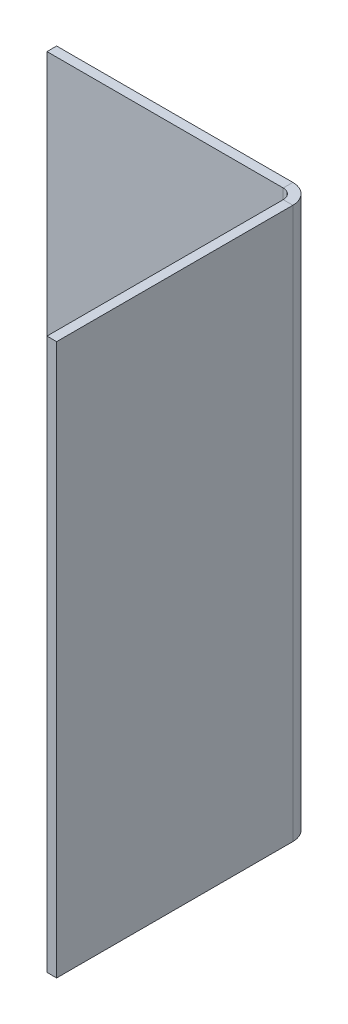
ISO-10303-21;
HEADER;
FILE_DESCRIPTION(('STEP AP214'),'2;1');
FILE_NAME('part.step','',(''),(''),'','','');
FILE_SCHEMA(('AUTOMOTIVE_DESIGN { 1 0 10303 214 1 1 1 1 }'));
ENDSEC;
DATA;
#1=APPLICATION_CONTEXT('core data for automotive mechanical design processes');
#2=APPLICATION_PROTOCOL_DEFINITION('international standard','automotive_design',2000,#1);
#3=PRODUCT_CONTEXT('',#1,'mechanical');
#4=PRODUCT('Part','Part','',(#3));
#5=PRODUCT_RELATED_PRODUCT_CATEGORY('part','',(#4));
#6=PRODUCT_DEFINITION_FORMATION('','',#4);
#7=PRODUCT_DEFINITION_CONTEXT('part definition',#1,'design');
#8=PRODUCT_DEFINITION('design','',#6,#7);
#9=PRODUCT_DEFINITION_SHAPE('','',#8);
#10=(LENGTH_UNIT() NAMED_UNIT(*) SI_UNIT(.MILLI.,.METRE.));
#11=(NAMED_UNIT(*) PLANE_ANGLE_UNIT() SI_UNIT($,.RADIAN.));
#12=(NAMED_UNIT(*) SI_UNIT($,.STERADIAN.) SOLID_ANGLE_UNIT());
#13=UNCERTAINTY_MEASURE_WITH_UNIT(LENGTH_MEASURE(1.E-05),#10,'distance_accuracy_value','');
#14=(GEOMETRIC_REPRESENTATION_CONTEXT(3) GLOBAL_UNCERTAINTY_ASSIGNED_CONTEXT((#13)) GLOBAL_UNIT_ASSIGNED_CONTEXT((#10,
#11,#12)) REPRESENTATION_CONTEXT('',''));
#15=CARTESIAN_POINT('',(0.,0.,0.));
#16=DIRECTION('',(0.,0.,1.));
#17=DIRECTION('',(1.,0.,0.));
#18=AXIS2_PLACEMENT_3D('',#15,#16,#17);
#19=CARTESIAN_POINT('',(17.8831863556524,0.,-18.1168136443477));
#20=DIRECTION('',(1.,0.,0.));
#21=DIRECTION('',(0.,0.,-1.));
#22=AXIS2_PLACEMENT_3D('',#19,#20,#21);
#23=PLANE('',#22);
#24=DIRECTION('',(0.,0.,-1.));
#25=VECTOR('',#24,1.);
#26=CARTESIAN_POINT('',(17.8831863556524,40.,-18.1168136443477));
#27=LINE('',#26,#25);
#28=CARTESIAN_POINT('',(17.8831863556523,40.,17.8831863556523));
#29=VERTEX_POINT('',#28);
#30=CARTESIAN_POINT('',(17.8831863556523,40.,0.736600000000004));
#31=VERTEX_POINT('',#30);
#32=EDGE_CURVE('E60',#29,#31,#27,.T.);
#33=ORIENTED_EDGE('',*,*,#32,.T.);
#34=DIRECTION('',(0.,-1.,0.));
#35=VECTOR('',#34,1.);
#36=CARTESIAN_POINT('',(17.8831863556523,0.,0.7366));
#37=LINE('',#36,#35);
#38=CARTESIAN_POINT('',(17.8831863556523,0.,0.7366));
#39=VERTEX_POINT('',#38);
#40=EDGE_CURVE('E52',#31,#39,#37,.T.);
#41=ORIENTED_EDGE('',*,*,#40,.T.);
#42=DIRECTION('',(0.,0.,1.));
#43=VECTOR('',#42,1.);
#44=CARTESIAN_POINT('',(17.8831863556524,0.,-18.1168136443477));
#45=LINE('',#44,#43);
#46=CARTESIAN_POINT('',(17.8831863556523,0.,17.8831863556523));
#47=VERTEX_POINT('',#46);
#48=EDGE_CURVE('E68',#39,#47,#45,.T.);
#49=ORIENTED_EDGE('',*,*,#48,.T.);
#50=DIRECTION('',(0.,1.,0.));
#51=VECTOR('',#50,1.);
#52=CARTESIAN_POINT('',(17.8831863556523,0.,17.8831863556523));
#53=LINE('',#52,#51);
#54=EDGE_CURVE('E158',#47,#29,#53,.T.);
#55=ORIENTED_EDGE('',*,*,#54,.T.);
#56=EDGE_LOOP('',(#33,#41,#49,#55));
#57=FACE_BOUND('',#56,.T.);
#58=ADVANCED_FACE('F43',(#57),#23,.F.);
#59=CARTESIAN_POINT('',(18.5831863556524,40.,-18.1168136443477));
#60=DIRECTION('',(0.,1.,0.));
#61=DIRECTION('',(-1.,0.,0.));
#62=AXIS2_PLACEMENT_3D('',#59,#60,#61);
#63=PLANE('',#62);
#64=DIRECTION('',(1.,0.,0.));
#65=VECTOR('',#64,1.);
#66=CARTESIAN_POINT('',(18.5831863556523,40.,0.736600000000004));
#67=LINE('',#66,#65);
#68=CARTESIAN_POINT('',(18.5831863556523,40.,0.736600000000007));
#69=VERTEX_POINT('',#68);
#70=EDGE_CURVE('E12',#31,#69,#67,.T.);
#71=ORIENTED_EDGE('',*,*,#70,.F.);
#72=ORIENTED_EDGE('',*,*,#32,.F.);
#73=DIRECTION('',(-1.,0.,0.));
#74=VECTOR('',#73,1.);
#75=CARTESIAN_POINT('',(18.5831863556523,40.,17.8831863556523));
#76=LINE('',#75,#74);
#77=CARTESIAN_POINT('',(18.5831863556523,40.,17.8831863556523));
#78=VERTEX_POINT('',#77);
#79=EDGE_CURVE('E160',#78,#29,#76,.T.);
#80=ORIENTED_EDGE('',*,*,#79,.F.);
#81=DIRECTION('',(0.,0.,-1.));
#82=VECTOR('',#81,1.);
#83=CARTESIAN_POINT('',(18.5831863556524,40.,-18.1168136443477));
#84=LINE('',#83,#82);
#85=EDGE_CURVE('E157',#78,#69,#84,.T.);
#86=ORIENTED_EDGE('',*,*,#85,.T.);
#87=EDGE_LOOP('',(#71,#72,#80,#86));
#88=FACE_BOUND('',#87,.T.);
#89=ADVANCED_FACE('F45',(#88),#63,.T.);
#90=CARTESIAN_POINT('',(18.5831863556523,0.,17.8831863556523));
#91=DIRECTION('',(0.,0.,1.));
#92=DIRECTION('',(1.,0.,0.));
#93=AXIS2_PLACEMENT_3D('',#90,#91,#92);
#94=PLANE('',#93);
#95=ORIENTED_EDGE('',*,*,#54,.F.);
#96=DIRECTION('',(-1.,0.,0.));
#97=VECTOR('',#96,1.);
#98=CARTESIAN_POINT('',(18.5831863556523,0.,17.8831863556523));
#99=LINE('',#98,#97);
#100=CARTESIAN_POINT('',(18.5831863556523,0.,17.8831863556523));
#101=VERTEX_POINT('',#100);
#102=EDGE_CURVE('E162',#101,#47,#99,.T.);
#103=ORIENTED_EDGE('',*,*,#102,.F.);
#104=DIRECTION('',(0.,1.,0.));
#105=VECTOR('',#104,1.);
#106=CARTESIAN_POINT('',(18.5831863556523,0.,17.8831863556523));
#107=LINE('',#106,#105);
#108=EDGE_CURVE('E154',#101,#78,#107,.T.);
#109=ORIENTED_EDGE('',*,*,#108,.T.);
#110=ORIENTED_EDGE('',*,*,#79,.T.);
#111=EDGE_LOOP('',(#95,#103,#109,#110));
#112=FACE_BOUND('',#111,.T.);
#113=ADVANCED_FACE('F178',(#112),#94,.T.);
#114=CARTESIAN_POINT('',(18.5831863556524,0.,-18.1168136443477));
#115=DIRECTION('',(0.,-1.,0.));
#116=DIRECTION('',(1.,0.,0.));
#117=AXIS2_PLACEMENT_3D('',#114,#115,#116);
#118=PLANE('',#117);
#119=DIRECTION('',(-1.,0.,0.));
#120=VECTOR('',#119,1.);
#121=CARTESIAN_POINT('',(18.5831863556523,0.,0.736600000000004));
#122=LINE('',#121,#120);
#123=CARTESIAN_POINT('',(18.5831863556523,0.,0.736600000000006));
#124=VERTEX_POINT('',#123);
#125=EDGE_CURVE('E165',#124,#39,#122,.T.);
#126=ORIENTED_EDGE('',*,*,#125,.F.);
#127=DIRECTION('',(0.,0.,1.));
#128=VECTOR('',#127,1.);
#129=CARTESIAN_POINT('',(18.5831863556524,0.,-18.1168136443477));
#130=LINE('',#129,#128);
#131=EDGE_CURVE('E47',#124,#101,#130,.T.);
#132=ORIENTED_EDGE('',*,*,#131,.T.);
#133=ORIENTED_EDGE('',*,*,#102,.T.);
#134=ORIENTED_EDGE('',*,*,#48,.F.);
#135=EDGE_LOOP('',(#126,#132,#133,#134));
#136=FACE_BOUND('',#135,.T.);
#137=ADVANCED_FACE('F173',(#136),#118,.T.);
#138=CARTESIAN_POINT('',(18.5831863556524,0.,-18.1168136443477));
#139=DIRECTION('',(1.,0.,0.));
#140=DIRECTION('',(0.,0.,-1.));
#141=AXIS2_PLACEMENT_3D('',#138,#139,#140);
#142=PLANE('',#141);
#143=DIRECTION('',(0.,-1.,0.));
#144=VECTOR('',#143,1.);
#145=CARTESIAN_POINT('',(18.5831863556523,0.,0.736600000000004));
#146=LINE('',#145,#144);
#147=EDGE_CURVE('E132',#69,#124,#146,.T.);
#148=ORIENTED_EDGE('',*,*,#147,.F.);
#149=ORIENTED_EDGE('',*,*,#85,.F.);
#150=ORIENTED_EDGE('',*,*,#108,.F.);
#151=ORIENTED_EDGE('',*,*,#131,.F.);
#152=EDGE_LOOP('',(#148,#149,#150,#151));
#153=FACE_BOUND('',#152,.T.);
#154=ADVANCED_FACE('F180',(#153),#142,.T.);
#155=CARTESIAN_POINT('',(0.,0.,-0.7));
#156=DIRECTION('',(-1.,0.,0.));
#157=DIRECTION('',(0.,0.,1.));
#158=AXIS2_PLACEMENT_3D('',#155,#156,#157);
#159=PLANE('',#158);
#160=DIRECTION('',(0.,-1.,0.));
#161=VECTOR('',#160,1.);
#162=CARTESIAN_POINT('',(0.,0.,0.));
#163=LINE('',#162,#161);
#164=CARTESIAN_POINT('',(0.,40.,0.));
#165=VERTEX_POINT('',#164);
#166=CARTESIAN_POINT('',(0.,0.,0.));
#167=VERTEX_POINT('',#166);
#168=EDGE_CURVE('E200',#165,#167,#163,.T.);
#169=ORIENTED_EDGE('',*,*,#168,.F.);
#170=DIRECTION('',(0.,0.,1.));
#171=VECTOR('',#170,1.);
#172=CARTESIAN_POINT('',(0.,40.,-0.7));
#173=LINE('',#172,#171);
#174=CARTESIAN_POINT('',(0.,40.,-0.7));
#175=VERTEX_POINT('',#174);
#176=EDGE_CURVE('E170',#175,#165,#173,.T.);
#177=ORIENTED_EDGE('',*,*,#176,.F.);
#178=DIRECTION('',(0.,-1.,0.));
#179=VECTOR('',#178,1.);
#180=CARTESIAN_POINT('',(0.,0.,-0.7));
#181=LINE('',#180,#179);
#182=CARTESIAN_POINT('',(0.,0.,-0.7));
#183=VERTEX_POINT('',#182);
#184=EDGE_CURVE('E151',#175,#183,#181,.T.);
#185=ORIENTED_EDGE('',*,*,#184,.T.);
#186=DIRECTION('',(0.,0.,1.));
#187=VECTOR('',#186,1.);
#188=CARTESIAN_POINT('',(0.,0.,-0.7));
#189=LINE('',#188,#187);
#190=EDGE_CURVE('E144',#183,#167,#189,.T.);
#191=ORIENTED_EDGE('',*,*,#190,.T.);
#192=EDGE_LOOP('',(#169,#177,#185,#191));
#193=FACE_BOUND('',#192,.T.);
#194=ADVANCED_FACE('F211',(#193),#159,.T.);
#195=CARTESIAN_POINT('',(0.,0.,-0.7));
#196=DIRECTION('',(0.,0.,-1.));
#197=DIRECTION('',(-1.,0.,0.));
#198=AXIS2_PLACEMENT_3D('',#195,#196,#197);
#199=PLANE('',#198);
#200=DIRECTION('',(-1.,0.,0.));
#201=VECTOR('',#200,1.);
#202=CARTESIAN_POINT('',(0.,40.,-0.7));
#203=LINE('',#202,#201);
#204=CARTESIAN_POINT('',(17.1465863556523,40.,-0.7));
#205=VERTEX_POINT('',#204);
#206=EDGE_CURVE('E142',#205,#175,#203,.T.);
#207=ORIENTED_EDGE('',*,*,#206,.F.);
#208=DIRECTION('',(0.,-1.,0.));
#209=VECTOR('',#208,1.);
#210=CARTESIAN_POINT('',(17.1465863556523,0.,-0.7));
#211=LINE('',#210,#209);
#212=CARTESIAN_POINT('',(17.1465863556523,0.,-0.7));
#213=VERTEX_POINT('',#212);
#214=EDGE_CURVE('E130',#205,#213,#211,.T.);
#215=ORIENTED_EDGE('',*,*,#214,.T.);
#216=DIRECTION('',(1.,0.,0.));
#217=VECTOR('',#216,1.);
#218=CARTESIAN_POINT('',(0.,0.,-0.7));
#219=LINE('',#218,#217);
#220=EDGE_CURVE('E123',#183,#213,#219,.T.);
#221=ORIENTED_EDGE('',*,*,#220,.F.);
#222=ORIENTED_EDGE('',*,*,#184,.F.);
#223=EDGE_LOOP('',(#207,#215,#221,#222));
#224=FACE_BOUND('',#223,.T.);
#225=ADVANCED_FACE('F139',(#224),#199,.T.);
#226=CARTESIAN_POINT('',(0.,0.,-0.7));
#227=DIRECTION('',(0.,-1.,0.));
#228=DIRECTION('',(0.,0.,-1.));
#229=AXIS2_PLACEMENT_3D('',#226,#227,#228);
#230=PLANE('',#229);
#231=ORIENTED_EDGE('',*,*,#220,.T.);
#232=DIRECTION('',(0.,0.,1.));
#233=VECTOR('',#232,1.);
#234=CARTESIAN_POINT('',(17.1465863556523,0.,-0.7));
#235=LINE('',#234,#233);
#236=CARTESIAN_POINT('',(17.1465863556523,0.,0.));
#237=VERTEX_POINT('',#236);
#238=EDGE_CURVE('E111',#213,#237,#235,.T.);
#239=ORIENTED_EDGE('',*,*,#238,.T.);
#240=DIRECTION('',(1.,0.,0.));
#241=VECTOR('',#240,1.);
#242=CARTESIAN_POINT('',(0.,0.,0.));
#243=LINE('',#242,#241);
#244=EDGE_CURVE('E197',#167,#237,#243,.T.);
#245=ORIENTED_EDGE('',*,*,#244,.F.);
#246=ORIENTED_EDGE('',*,*,#190,.F.);
#247=EDGE_LOOP('',(#231,#239,#245,#246));
#248=FACE_BOUND('',#247,.T.);
#249=ADVANCED_FACE('F146',(#248),#230,.T.);
#250=CARTESIAN_POINT('',(0.,0.,0.));
#251=DIRECTION('',(0.,0.,-1.));
#252=DIRECTION('',(-1.,0.,0.));
#253=AXIS2_PLACEMENT_3D('',#250,#251,#252);
#254=PLANE('',#253);
#255=DIRECTION('',(0.,-1.,0.));
#256=VECTOR('',#255,1.);
#257=CARTESIAN_POINT('',(17.1465863556523,0.,0.));
#258=LINE('',#257,#256);
#259=CARTESIAN_POINT('',(17.1465863556523,40.,0.));
#260=VERTEX_POINT('',#259);
#261=EDGE_CURVE('E133',#260,#237,#258,.T.);
#262=ORIENTED_EDGE('',*,*,#261,.F.);
#263=DIRECTION('',(-1.,0.,0.));
#264=VECTOR('',#263,1.);
#265=CARTESIAN_POINT('',(0.,40.,0.));
#266=LINE('',#265,#264);
#267=EDGE_CURVE('E122',#260,#165,#266,.T.);
#268=ORIENTED_EDGE('',*,*,#267,.T.);
#269=ORIENTED_EDGE('',*,*,#168,.T.);
#270=ORIENTED_EDGE('',*,*,#244,.T.);
#271=EDGE_LOOP('',(#262,#268,#269,#270));
#272=FACE_BOUND('',#271,.T.);
#273=ADVANCED_FACE('F205',(#272),#254,.F.);
#274=CARTESIAN_POINT('',(0.,40.,-0.7));
#275=DIRECTION('',(0.,1.,0.));
#276=DIRECTION('',(0.,0.,1.));
#277=AXIS2_PLACEMENT_3D('',#274,#275,#276);
#278=PLANE('',#277);
#279=ORIENTED_EDGE('',*,*,#267,.F.);
#280=DIRECTION('',(0.,0.,-1.));
#281=VECTOR('',#280,1.);
#282=CARTESIAN_POINT('',(17.1465863556523,40.,-0.7));
#283=LINE('',#282,#281);
#284=EDGE_CURVE('E195',#260,#205,#283,.T.);
#285=ORIENTED_EDGE('',*,*,#284,.T.);
#286=ORIENTED_EDGE('',*,*,#206,.T.);
#287=ORIENTED_EDGE('',*,*,#176,.T.);
#288=EDGE_LOOP('',(#279,#285,#286,#287));
#289=FACE_BOUND('',#288,.T.);
#290=ADVANCED_FACE('F209',(#289),#278,.T.);
#291=CARTESIAN_POINT('',(17.1465863556523,40.,0.7366));
#292=DIRECTION('',(0.,1.,0.));
#293=DIRECTION('',(0.,0.,1.));
#294=AXIS2_PLACEMENT_3D('',#291,#292,#293);
#295=PLANE('',#294);
#296=ORIENTED_EDGE('',*,*,#284,.F.);
#297=CARTESIAN_POINT('',(17.1465863556523,40.,0.7366));
#298=DIRECTION('',(0.,-1.,0.));
#299=DIRECTION('',(1.,0.,0.));
#300=AXIS2_PLACEMENT_3D('',#297,#298,#299);
#301=CIRCLE('',#300,0.7366);
#302=EDGE_CURVE('E187',#260,#31,#301,.T.);
#303=ORIENTED_EDGE('',*,*,#302,.T.);
#304=ORIENTED_EDGE('',*,*,#70,.T.);
#305=CARTESIAN_POINT('',(17.1465863556523,40.,0.7366));
#306=DIRECTION('',(0.,-1.,0.));
#307=DIRECTION('',(0.,0.,1.));
#308=AXIS2_PLACEMENT_3D('',#305,#306,#307);
#309=CIRCLE('',#308,1.4366);
#310=EDGE_CURVE('E134',#205,#69,#309,.T.);
#311=ORIENTED_EDGE('',*,*,#310,.F.);
#312=EDGE_LOOP('',(#296,#303,#304,#311));
#313=FACE_BOUND('',#312,.T.);
#314=ADVANCED_FACE('F185',(#313),#295,.T.);
#315=CARTESIAN_POINT('',(17.1465863556523,0.,0.7366));
#316=DIRECTION('',(0.,-1.,0.));
#317=DIRECTION('',(1.,0.,0.));
#318=AXIS2_PLACEMENT_3D('',#315,#316,#317);
#319=PLANE('',#318);
#320=CARTESIAN_POINT('',(17.1465863556523,0.,0.7366));
#321=DIRECTION('',(0.,-1.,0.));
#322=DIRECTION('',(1.,0.,0.));
#323=AXIS2_PLACEMENT_3D('',#320,#321,#322);
#324=CIRCLE('',#323,0.7366);
#325=EDGE_CURVE('E117',#39,#237,#324,.F.);
#326=ORIENTED_EDGE('',*,*,#325,.T.);
#327=ORIENTED_EDGE('',*,*,#238,.F.);
#328=CARTESIAN_POINT('',(17.1465863556523,0.,0.7366));
#329=DIRECTION('',(0.,1.,0.));
#330=DIRECTION('',(1.,0.,0.));
#331=AXIS2_PLACEMENT_3D('',#328,#329,#330);
#332=CIRCLE('',#331,1.4366);
#333=EDGE_CURVE('E115',#124,#213,#332,.T.);
#334=ORIENTED_EDGE('',*,*,#333,.F.);
#335=ORIENTED_EDGE('',*,*,#125,.T.);
#336=EDGE_LOOP('',(#326,#327,#334,#335));
#337=FACE_BOUND('',#336,.T.);
#338=ADVANCED_FACE('F113',(#337),#319,.T.);
#339=CARTESIAN_POINT('',(17.1465863556523,60.0425181450098,0.7366));
#340=DIRECTION('',(0.,-1.,0.));
#341=DIRECTION('',(1.,0.,0.));
#342=AXIS2_PLACEMENT_3D('',#339,#340,#341);
#343=CYLINDRICAL_SURFACE('',#342,1.4366);
#344=ORIENTED_EDGE('',*,*,#147,.T.);
#345=ORIENTED_EDGE('',*,*,#333,.T.);
#346=ORIENTED_EDGE('',*,*,#214,.F.);
#347=ORIENTED_EDGE('',*,*,#310,.T.);
#348=EDGE_LOOP('',(#344,#345,#346,#347));
#349=FACE_BOUND('',#348,.T.);
#350=ADVANCED_FACE('F128',(#349),#343,.T.);
#351=CARTESIAN_POINT('',(17.1465863556523,60.0425181450098,0.7366));
#352=DIRECTION('',(0.,-1.,0.));
#353=DIRECTION('',(1.,0.,0.));
#354=AXIS2_PLACEMENT_3D('',#351,#352,#353);
#355=CYLINDRICAL_SURFACE('',#354,0.7366);
#356=ORIENTED_EDGE('',*,*,#40,.F.);
#357=ORIENTED_EDGE('',*,*,#302,.F.);
#358=ORIENTED_EDGE('',*,*,#261,.T.);
#359=ORIENTED_EDGE('',*,*,#325,.F.);
#360=EDGE_LOOP('',(#356,#357,#358,#359));
#361=FACE_BOUND('',#360,.T.);
#362=ADVANCED_FACE('F264',(#361),#355,.F.);
#363=CLOSED_SHELL('',(#58,#89,#113,#137,#154,#194,#225,#249,#273,#290,#314,#338,#350,#362));
#364=MANIFOLD_SOLID_BREP('B2',#363);
#365=ADVANCED_BREP_SHAPE_REPRESENTATION('',(#18,#364),#14);
#366=SHAPE_DEFINITION_REPRESENTATION(#9,#365);
ENDSEC;
END-ISO-10303-21;
